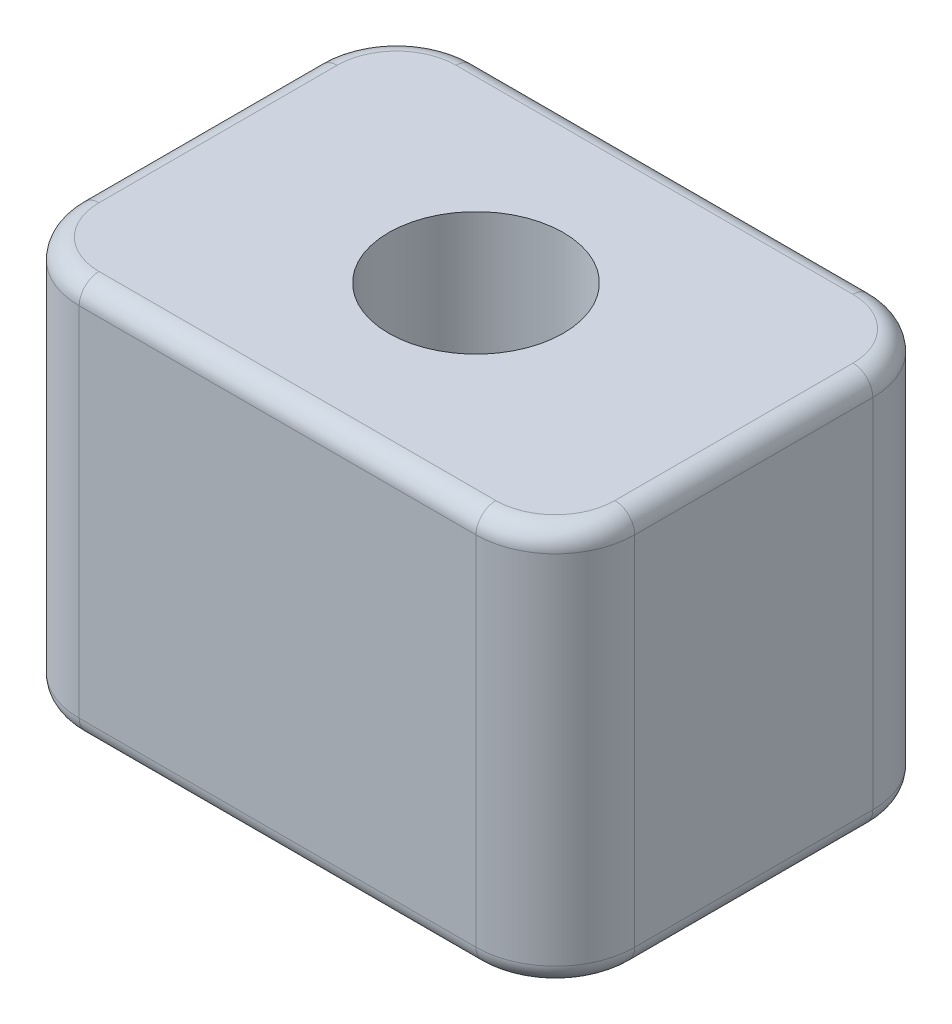
ISO-10303-21;
HEADER;
FILE_DESCRIPTION(('STEP AP214'),'2;1');
FILE_NAME('part.step','',(''),(''),'','','');
FILE_SCHEMA(('AUTOMOTIVE_DESIGN { 1 0 10303 214 1 1 1 1 }'));
ENDSEC;
DATA;
#1=APPLICATION_CONTEXT('core data for automotive mechanical design processes');
#2=APPLICATION_PROTOCOL_DEFINITION('international standard','automotive_design',2000,#1);
#3=PRODUCT_CONTEXT('',#1,'mechanical');
#4=PRODUCT('Part','Part','',(#3));
#5=PRODUCT_RELATED_PRODUCT_CATEGORY('part','',(#4));
#6=PRODUCT_DEFINITION_FORMATION('','',#4);
#7=PRODUCT_DEFINITION_CONTEXT('part definition',#1,'design');
#8=PRODUCT_DEFINITION('design','',#6,#7);
#9=PRODUCT_DEFINITION_SHAPE('','',#8);
#10=(LENGTH_UNIT() NAMED_UNIT(*) SI_UNIT(.MILLI.,.METRE.));
#11=(NAMED_UNIT(*) PLANE_ANGLE_UNIT() SI_UNIT($,.RADIAN.));
#12=(NAMED_UNIT(*) SI_UNIT($,.STERADIAN.) SOLID_ANGLE_UNIT());
#13=UNCERTAINTY_MEASURE_WITH_UNIT(LENGTH_MEASURE(1.E-05),#10,'distance_accuracy_value','');
#14=(GEOMETRIC_REPRESENTATION_CONTEXT(3) GLOBAL_UNCERTAINTY_ASSIGNED_CONTEXT((#13)) GLOBAL_UNIT_ASSIGNED_CONTEXT((#10,
#11,#12)) REPRESENTATION_CONTEXT('',''));
#15=CARTESIAN_POINT('',(0.,0.,0.));
#16=DIRECTION('',(0.,0.,1.));
#17=DIRECTION('',(1.,0.,0.));
#18=AXIS2_PLACEMENT_3D('',#15,#16,#17);
#19=CARTESIAN_POINT('',(0.,5.,0.));
#20=DIRECTION('',(0.,-1.,0.));
#21=DIRECTION('',(0.,0.,-1.));
#22=AXIS2_PLACEMENT_3D('',#19,#20,#21);
#23=PLANE('',#22);
#24=DIRECTION('',(0.,0.,1.));
#25=VECTOR('',#24,1.);
#26=CARTESIAN_POINT('',(-3.25,5.,0.));
#27=LINE('',#26,#25);
#28=CARTESIAN_POINT('',(-3.25,5.,-1.5));
#29=VERTEX_POINT('',#28);
#30=CARTESIAN_POINT('',(-3.25,5.,1.5));
#31=VERTEX_POINT('',#30);
#32=EDGE_CURVE('E171',#29,#31,#27,.T.);
#33=ORIENTED_EDGE('',*,*,#32,.T.);
#34=CARTESIAN_POINT('',(-2.5,5.,1.5));
#35=DIRECTION('',(0.,-1.,0.));
#36=DIRECTION('',(0.,0.,-1.));
#37=AXIS2_PLACEMENT_3D('',#34,#35,#36);
#38=CIRCLE('',#37,0.75);
#39=CARTESIAN_POINT('',(-2.5,5.,2.25));
#40=VERTEX_POINT('',#39);
#41=EDGE_CURVE('E152',#31,#40,#38,.F.);
#42=ORIENTED_EDGE('',*,*,#41,.T.);
#43=DIRECTION('',(1.,0.,0.));
#44=VECTOR('',#43,1.);
#45=CARTESIAN_POINT('',(0.,5.,2.25));
#46=LINE('',#45,#44);
#47=CARTESIAN_POINT('',(2.5,5.,2.25));
#48=VERTEX_POINT('',#47);
#49=EDGE_CURVE('E160',#40,#48,#46,.T.);
#50=ORIENTED_EDGE('',*,*,#49,.T.);
#51=CARTESIAN_POINT('',(2.5,5.,1.5));
#52=DIRECTION('',(0.,-1.,0.));
#53=DIRECTION('',(0.,0.,-1.));
#54=AXIS2_PLACEMENT_3D('',#51,#52,#53);
#55=CIRCLE('',#54,0.75);
#56=CARTESIAN_POINT('',(3.25,5.,1.5));
#57=VERTEX_POINT('',#56);
#58=EDGE_CURVE('E166',#48,#57,#55,.F.);
#59=ORIENTED_EDGE('',*,*,#58,.T.);
#60=DIRECTION('',(0.,0.,-1.));
#61=VECTOR('',#60,1.);
#62=CARTESIAN_POINT('',(3.25,5.,0.));
#63=LINE('',#62,#61);
#64=CARTESIAN_POINT('',(3.25,5.,-1.5));
#65=VERTEX_POINT('',#64);
#66=EDGE_CURVE('E302',#57,#65,#63,.T.);
#67=ORIENTED_EDGE('',*,*,#66,.T.);
#68=CARTESIAN_POINT('',(2.5,5.,-1.5));
#69=DIRECTION('',(0.,-1.,0.));
#70=DIRECTION('',(0.,0.,-1.));
#71=AXIS2_PLACEMENT_3D('',#68,#69,#70);
#72=CIRCLE('',#71,0.75);
#73=CARTESIAN_POINT('',(2.5,5.,-2.25));
#74=VERTEX_POINT('',#73);
#75=EDGE_CURVE('E304',#65,#74,#72,.F.);
#76=ORIENTED_EDGE('',*,*,#75,.T.);
#77=DIRECTION('',(-1.,0.,0.));
#78=VECTOR('',#77,1.);
#79=CARTESIAN_POINT('',(0.,5.,-2.25));
#80=LINE('',#79,#78);
#81=CARTESIAN_POINT('',(-2.5,5.,-2.25));
#82=VERTEX_POINT('',#81);
#83=EDGE_CURVE('E306',#74,#82,#80,.T.);
#84=ORIENTED_EDGE('',*,*,#83,.T.);
#85=CARTESIAN_POINT('',(-2.5,5.,-1.5));
#86=DIRECTION('',(0.,-1.,0.));
#87=DIRECTION('',(0.,0.,-1.));
#88=AXIS2_PLACEMENT_3D('',#85,#86,#87);
#89=CIRCLE('',#88,0.75);
#90=EDGE_CURVE('E176',#82,#29,#89,.F.);
#91=ORIENTED_EDGE('',*,*,#90,.T.);
#92=EDGE_LOOP('',(#33,#42,#50,#59,#67,#76,#84,#91));
#93=FACE_BOUND('',#92,.T.);
#94=CARTESIAN_POINT('',(0.,5.,0.));
#95=DIRECTION('',(0.,1.,0.));
#96=DIRECTION('',(0.,0.,1.));
#97=AXIS2_PLACEMENT_3D('',#94,#95,#96);
#98=CIRCLE('',#97,1.1);
#99=CARTESIAN_POINT('',(0.,5.,1.1));
#100=VERTEX_POINT('',#99);
#101=EDGE_CURVE('E596',#100,#100,#98,.T.);
#102=ORIENTED_EDGE('',*,*,#101,.F.);
#103=EDGE_LOOP('',(#102));
#104=FACE_BOUND('',#103,.T.);
#105=ADVANCED_FACE('F35',(#93,#104),#23,.F.);
#106=CARTESIAN_POINT('',(0.,0.,0.));
#107=DIRECTION('',(0.,-1.,0.));
#108=DIRECTION('',(0.,0.,-1.));
#109=AXIS2_PLACEMENT_3D('',#106,#107,#108);
#110=PLANE('',#109);
#111=CARTESIAN_POINT('',(2.5,0.,-1.5));
#112=DIRECTION('',(0.,-1.,0.));
#113=DIRECTION('',(0.,0.,-1.));
#114=AXIS2_PLACEMENT_3D('',#111,#112,#113);
#115=CIRCLE('',#114,0.75);
#116=CARTESIAN_POINT('',(2.5,0.,-2.25));
#117=VERTEX_POINT('',#116);
#118=CARTESIAN_POINT('',(3.25,0.,-1.5));
#119=VERTEX_POINT('',#118);
#120=EDGE_CURVE('E52',#117,#119,#115,.T.);
#121=ORIENTED_EDGE('',*,*,#120,.T.);
#122=DIRECTION('',(0.,0.,-1.));
#123=VECTOR('',#122,1.);
#124=CARTESIAN_POINT('',(3.25,0.,1.5));
#125=LINE('',#124,#123);
#126=CARTESIAN_POINT('',(3.25,0.,1.5));
#127=VERTEX_POINT('',#126);
#128=EDGE_CURVE('E56',#119,#127,#125,.F.);
#129=ORIENTED_EDGE('',*,*,#128,.T.);
#130=CARTESIAN_POINT('',(2.5,0.,1.5));
#131=DIRECTION('',(0.,-1.,0.));
#132=DIRECTION('',(0.,0.,-1.));
#133=AXIS2_PLACEMENT_3D('',#130,#131,#132);
#134=CIRCLE('',#133,0.75);
#135=CARTESIAN_POINT('',(2.5,0.,2.25));
#136=VERTEX_POINT('',#135);
#137=EDGE_CURVE('E217',#127,#136,#134,.T.);
#138=ORIENTED_EDGE('',*,*,#137,.T.);
#139=DIRECTION('',(1.,0.,0.));
#140=VECTOR('',#139,1.);
#141=CARTESIAN_POINT('',(-2.5,0.,2.25));
#142=LINE('',#141,#140);
#143=CARTESIAN_POINT('',(-2.5,0.,2.25));
#144=VERTEX_POINT('',#143);
#145=EDGE_CURVE('E215',#136,#144,#142,.F.);
#146=ORIENTED_EDGE('',*,*,#145,.T.);
#147=CARTESIAN_POINT('',(-2.5,0.,1.5));
#148=DIRECTION('',(0.,-1.,0.));
#149=DIRECTION('',(0.,0.,-1.));
#150=AXIS2_PLACEMENT_3D('',#147,#148,#149);
#151=CIRCLE('',#150,0.75);
#152=CARTESIAN_POINT('',(-3.25,0.,1.5));
#153=VERTEX_POINT('',#152);
#154=EDGE_CURVE('E208',#144,#153,#151,.T.);
#155=ORIENTED_EDGE('',*,*,#154,.T.);
#156=DIRECTION('',(0.,0.,1.));
#157=VECTOR('',#156,1.);
#158=CARTESIAN_POINT('',(-3.25,0.,-1.5));
#159=LINE('',#158,#157);
#160=CARTESIAN_POINT('',(-3.25,0.,-1.5));
#161=VERTEX_POINT('',#160);
#162=EDGE_CURVE('E206',#153,#161,#159,.F.);
#163=ORIENTED_EDGE('',*,*,#162,.T.);
#164=CARTESIAN_POINT('',(-2.5,0.,-1.5));
#165=DIRECTION('',(0.,-1.,0.));
#166=DIRECTION('',(0.,0.,-1.));
#167=AXIS2_PLACEMENT_3D('',#164,#165,#166);
#168=CIRCLE('',#167,0.75);
#169=CARTESIAN_POINT('',(-2.5,0.,-2.25));
#170=VERTEX_POINT('',#169);
#171=EDGE_CURVE('E210',#161,#170,#168,.T.);
#172=ORIENTED_EDGE('',*,*,#171,.T.);
#173=DIRECTION('',(-1.,0.,0.));
#174=VECTOR('',#173,1.);
#175=CARTESIAN_POINT('',(2.5,0.,-2.25));
#176=LINE('',#175,#174);
#177=EDGE_CURVE('E213',#170,#117,#176,.F.);
#178=ORIENTED_EDGE('',*,*,#177,.T.);
#179=EDGE_LOOP('',(#121,#129,#138,#146,#155,#163,#172,#178));
#180=FACE_BOUND('',#179,.T.);
#181=CARTESIAN_POINT('',(0.,0.,0.));
#182=DIRECTION('',(0.,1.,0.));
#183=DIRECTION('',(0.,0.,1.));
#184=AXIS2_PLACEMENT_3D('',#181,#182,#183);
#185=CIRCLE('',#184,1.1);
#186=CARTESIAN_POINT('',(0.,0.,1.1));
#187=VERTEX_POINT('',#186);
#188=EDGE_CURVE('E239',#187,#187,#185,.T.);
#189=ORIENTED_EDGE('',*,*,#188,.T.);
#190=EDGE_LOOP('',(#189));
#191=FACE_BOUND('',#190,.T.);
#192=ADVANCED_FACE('F345',(#180,#191),#110,.T.);
#193=CARTESIAN_POINT('',(3.5,5.,2.5));
#194=DIRECTION('',(-1.,0.,0.));
#195=DIRECTION('',(0.,0.,1.));
#196=AXIS2_PLACEMENT_3D('',#193,#194,#195);
#197=PLANE('',#196);
#198=DIRECTION('',(0.,-1.,0.));
#199=VECTOR('',#198,1.);
#200=CARTESIAN_POINT('',(3.5,5.,-1.5));
#201=LINE('',#200,#199);
#202=CARTESIAN_POINT('',(3.5,0.25,-1.5));
#203=VERTEX_POINT('',#202);
#204=CARTESIAN_POINT('',(3.5,4.75,-1.5));
#205=VERTEX_POINT('',#204);
#206=EDGE_CURVE('E283',#203,#205,#201,.F.);
#207=ORIENTED_EDGE('',*,*,#206,.T.);
#208=DIRECTION('',(0.,0.,-1.));
#209=VECTOR('',#208,1.);
#210=CARTESIAN_POINT('',(3.5,4.75,2.5));
#211=LINE('',#210,#209);
#212=CARTESIAN_POINT('',(3.5,4.75,1.5));
#213=VERTEX_POINT('',#212);
#214=EDGE_CURVE('E200',#205,#213,#211,.F.);
#215=ORIENTED_EDGE('',*,*,#214,.T.);
#216=DIRECTION('',(0.,-1.,0.));
#217=VECTOR('',#216,1.);
#218=CARTESIAN_POINT('',(3.5,5.,1.5));
#219=LINE('',#218,#217);
#220=CARTESIAN_POINT('',(3.5,0.25,1.5));
#221=VERTEX_POINT('',#220);
#222=EDGE_CURVE('E274',#213,#221,#219,.T.);
#223=ORIENTED_EDGE('',*,*,#222,.T.);
#224=DIRECTION('',(0.,0.,-1.));
#225=VECTOR('',#224,1.);
#226=CARTESIAN_POINT('',(3.5,0.25,-1.5));
#227=LINE('',#226,#225);
#228=EDGE_CURVE('E198',#221,#203,#227,.T.);
#229=ORIENTED_EDGE('',*,*,#228,.T.);
#230=EDGE_LOOP('',(#207,#215,#223,#229));
#231=FACE_BOUND('',#230,.T.);
#232=ADVANCED_FACE('F280',(#231),#197,.F.);
#233=CARTESIAN_POINT('',(-3.5,5.,-2.5));
#234=DIRECTION('',(0.,0.,1.));
#235=DIRECTION('',(1.,0.,0.));
#236=AXIS2_PLACEMENT_3D('',#233,#234,#235);
#237=PLANE('',#236);
#238=DIRECTION('',(0.,-1.,0.));
#239=VECTOR('',#238,1.);
#240=CARTESIAN_POINT('',(-2.5,5.,-2.5));
#241=LINE('',#240,#239);
#242=CARTESIAN_POINT('',(-2.5,0.25,-2.5));
#243=VERTEX_POINT('',#242);
#244=CARTESIAN_POINT('',(-2.5,4.75,-2.5));
#245=VERTEX_POINT('',#244);
#246=EDGE_CURVE('E289',#243,#245,#241,.F.);
#247=ORIENTED_EDGE('',*,*,#246,.T.);
#248=DIRECTION('',(-1.,0.,0.));
#249=VECTOR('',#248,1.);
#250=CARTESIAN_POINT('',(-3.5,4.75,-2.5));
#251=LINE('',#250,#249);
#252=CARTESIAN_POINT('',(2.5,4.75,-2.5));
#253=VERTEX_POINT('',#252);
#254=EDGE_CURVE('E192',#245,#253,#251,.F.);
#255=ORIENTED_EDGE('',*,*,#254,.T.);
#256=DIRECTION('',(0.,-1.,0.));
#257=VECTOR('',#256,1.);
#258=CARTESIAN_POINT('',(2.5,5.,-2.5));
#259=LINE('',#258,#257);
#260=CARTESIAN_POINT('',(2.5,0.25,-2.5));
#261=VERTEX_POINT('',#260);
#262=EDGE_CURVE('E284',#253,#261,#259,.T.);
#263=ORIENTED_EDGE('',*,*,#262,.T.);
#264=DIRECTION('',(-1.,0.,0.));
#265=VECTOR('',#264,1.);
#266=CARTESIAN_POINT('',(-2.5,0.25,-2.5));
#267=LINE('',#266,#265);
#268=EDGE_CURVE('E190',#261,#243,#267,.T.);
#269=ORIENTED_EDGE('',*,*,#268,.T.);
#270=EDGE_LOOP('',(#247,#255,#263,#269));
#271=FACE_BOUND('',#270,.T.);
#272=ADVANCED_FACE('F369',(#271),#237,.F.);
#273=CARTESIAN_POINT('',(-3.5,5.,2.5));
#274=DIRECTION('',(1.,0.,0.));
#275=DIRECTION('',(0.,0.,-1.));
#276=AXIS2_PLACEMENT_3D('',#273,#274,#275);
#277=PLANE('',#276);
#278=DIRECTION('',(0.,-1.,0.));
#279=VECTOR('',#278,1.);
#280=CARTESIAN_POINT('',(-3.5,5.,1.5));
#281=LINE('',#280,#279);
#282=CARTESIAN_POINT('',(-3.5,0.25,1.5));
#283=VERTEX_POINT('',#282);
#284=CARTESIAN_POINT('',(-3.5,4.75,1.5));
#285=VERTEX_POINT('',#284);
#286=EDGE_CURVE('E167',#283,#285,#281,.F.);
#287=ORIENTED_EDGE('',*,*,#286,.T.);
#288=DIRECTION('',(0.,0.,1.));
#289=VECTOR('',#288,1.);
#290=CARTESIAN_POINT('',(-3.5,4.75,2.5));
#291=LINE('',#290,#289);
#292=CARTESIAN_POINT('',(-3.5,4.75,-1.5));
#293=VERTEX_POINT('',#292);
#294=EDGE_CURVE('E183',#285,#293,#291,.F.);
#295=ORIENTED_EDGE('',*,*,#294,.T.);
#296=DIRECTION('',(0.,-1.,0.));
#297=VECTOR('',#296,1.);
#298=CARTESIAN_POINT('',(-3.5,5.,-1.5));
#299=LINE('',#298,#297);
#300=CARTESIAN_POINT('',(-3.5,0.25,-1.5));
#301=VERTEX_POINT('',#300);
#302=EDGE_CURVE('E296',#293,#301,#299,.T.);
#303=ORIENTED_EDGE('',*,*,#302,.T.);
#304=DIRECTION('',(0.,0.,1.));
#305=VECTOR('',#304,1.);
#306=CARTESIAN_POINT('',(-3.5,0.25,1.5));
#307=LINE('',#306,#305);
#308=EDGE_CURVE('E181',#301,#283,#307,.T.);
#309=ORIENTED_EDGE('',*,*,#308,.T.);
#310=EDGE_LOOP('',(#287,#295,#303,#309));
#311=FACE_BOUND('',#310,.T.);
#312=ADVANCED_FACE('F324',(#311),#277,.F.);
#313=CARTESIAN_POINT('',(-3.5,5.,2.5));
#314=DIRECTION('',(0.,0.,-1.));
#315=DIRECTION('',(-1.,0.,0.));
#316=AXIS2_PLACEMENT_3D('',#313,#314,#315);
#317=PLANE('',#316);
#318=DIRECTION('',(0.,-1.,0.));
#319=VECTOR('',#318,1.);
#320=CARTESIAN_POINT('',(2.5,5.,2.5));
#321=LINE('',#320,#319);
#322=CARTESIAN_POINT('',(2.5,0.25,2.5));
#323=VERTEX_POINT('',#322);
#324=CARTESIAN_POINT('',(2.5,4.75,2.5));
#325=VERTEX_POINT('',#324);
#326=EDGE_CURVE('E277',#323,#325,#321,.F.);
#327=ORIENTED_EDGE('',*,*,#326,.T.);
#328=DIRECTION('',(1.,0.,0.));
#329=VECTOR('',#328,1.);
#330=CARTESIAN_POINT('',(-3.5,4.75,2.5));
#331=LINE('',#330,#329);
#332=CARTESIAN_POINT('',(-2.5,4.75,2.5));
#333=VERTEX_POINT('',#332);
#334=EDGE_CURVE('E11',#325,#333,#331,.F.);
#335=ORIENTED_EDGE('',*,*,#334,.T.);
#336=DIRECTION('',(0.,-1.,0.));
#337=VECTOR('',#336,1.);
#338=CARTESIAN_POINT('',(-2.5,5.,2.5));
#339=LINE('',#338,#337);
#340=CARTESIAN_POINT('',(-2.5,0.25,2.5));
#341=VERTEX_POINT('',#340);
#342=EDGE_CURVE('E286',#333,#341,#339,.T.);
#343=ORIENTED_EDGE('',*,*,#342,.T.);
#344=DIRECTION('',(1.,0.,0.));
#345=VECTOR('',#344,1.);
#346=CARTESIAN_POINT('',(2.5,0.25,2.5));
#347=LINE('',#346,#345);
#348=EDGE_CURVE('E44',#341,#323,#347,.T.);
#349=ORIENTED_EDGE('',*,*,#348,.T.);
#350=EDGE_LOOP('',(#327,#335,#343,#349));
#351=FACE_BOUND('',#350,.T.);
#352=ADVANCED_FACE('F351',(#351),#317,.F.);
#353=CARTESIAN_POINT('',(0.,5.,0.));
#354=DIRECTION('',(0.,-1.,0.));
#355=DIRECTION('',(0.,0.,-1.));
#356=AXIS2_PLACEMENT_3D('',#353,#354,#355);
#357=CYLINDRICAL_SURFACE('',#356,1.1);
#358=ORIENTED_EDGE('',*,*,#101,.T.);
#359=EDGE_LOOP('',(#358));
#360=FACE_BOUND('',#359,.T.);
#361=ORIENTED_EDGE('',*,*,#188,.F.);
#362=EDGE_LOOP('',(#361));
#363=FACE_BOUND('',#362,.T.);
#364=ADVANCED_FACE('F391',(#360,#363),#357,.F.);
#365=CARTESIAN_POINT('',(2.5,5.,-1.5));
#366=DIRECTION('',(0.,-1.,0.));
#367=DIRECTION('',(0.,0.,-1.));
#368=AXIS2_PLACEMENT_3D('',#365,#366,#367);
#369=CYLINDRICAL_SURFACE('',#368,1.);
#370=ORIENTED_EDGE('',*,*,#262,.F.);
#371=CARTESIAN_POINT('',(2.5,4.75,-1.5));
#372=DIRECTION('',(0.,-1.,0.));
#373=DIRECTION('',(0.,0.,-1.));
#374=AXIS2_PLACEMENT_3D('',#371,#372,#373);
#375=CIRCLE('',#374,1.);
#376=EDGE_CURVE('E196',#253,#205,#375,.T.);
#377=ORIENTED_EDGE('',*,*,#376,.T.);
#378=ORIENTED_EDGE('',*,*,#206,.F.);
#379=CARTESIAN_POINT('',(2.5,0.25,-1.5));
#380=DIRECTION('',(0.,-1.,0.));
#381=DIRECTION('',(0.,0.,-1.));
#382=AXIS2_PLACEMENT_3D('',#379,#380,#381);
#383=CIRCLE('',#382,1.);
#384=EDGE_CURVE('E194',#203,#261,#383,.F.);
#385=ORIENTED_EDGE('',*,*,#384,.T.);
#386=EDGE_LOOP('',(#370,#377,#378,#385));
#387=FACE_BOUND('',#386,.T.);
#388=ADVANCED_FACE('F371',(#387),#369,.T.);
#389=CARTESIAN_POINT('',(2.5,5.,1.5));
#390=DIRECTION('',(0.,-1.,0.));
#391=DIRECTION('',(0.,0.,-1.));
#392=AXIS2_PLACEMENT_3D('',#389,#390,#391);
#393=CYLINDRICAL_SURFACE('',#392,1.);
#394=ORIENTED_EDGE('',*,*,#222,.F.);
#395=CARTESIAN_POINT('',(2.5,4.75,1.5));
#396=DIRECTION('',(0.,-1.,0.));
#397=DIRECTION('',(0.,0.,-1.));
#398=AXIS2_PLACEMENT_3D('',#395,#396,#397);
#399=CIRCLE('',#398,1.);
#400=EDGE_CURVE('E204',#213,#325,#399,.T.);
#401=ORIENTED_EDGE('',*,*,#400,.T.);
#402=ORIENTED_EDGE('',*,*,#326,.F.);
#403=CARTESIAN_POINT('',(2.5,0.25,1.5));
#404=DIRECTION('',(0.,-1.,0.));
#405=DIRECTION('',(0.,0.,-1.));
#406=AXIS2_PLACEMENT_3D('',#403,#404,#405);
#407=CIRCLE('',#406,1.);
#408=EDGE_CURVE('E202',#323,#221,#407,.F.);
#409=ORIENTED_EDGE('',*,*,#408,.T.);
#410=EDGE_LOOP('',(#394,#401,#402,#409));
#411=FACE_BOUND('',#410,.T.);
#412=ADVANCED_FACE('F273',(#411),#393,.T.);
#413=CARTESIAN_POINT('',(-2.5,5.,1.5));
#414=DIRECTION('',(0.,-1.,0.));
#415=DIRECTION('',(0.,0.,-1.));
#416=AXIS2_PLACEMENT_3D('',#413,#414,#415);
#417=CYLINDRICAL_SURFACE('',#416,1.);
#418=ORIENTED_EDGE('',*,*,#342,.F.);
#419=CARTESIAN_POINT('',(-2.5,4.75,1.5));
#420=DIRECTION('',(0.,-1.,0.));
#421=DIRECTION('',(0.,0.,-1.));
#422=AXIS2_PLACEMENT_3D('',#419,#420,#421);
#423=CIRCLE('',#422,1.);
#424=EDGE_CURVE('E154',#333,#285,#423,.T.);
#425=ORIENTED_EDGE('',*,*,#424,.T.);
#426=ORIENTED_EDGE('',*,*,#286,.F.);
#427=CARTESIAN_POINT('',(-2.5,0.25,1.5));
#428=DIRECTION('',(0.,-1.,0.));
#429=DIRECTION('',(0.,0.,-1.));
#430=AXIS2_PLACEMENT_3D('',#427,#428,#429);
#431=CIRCLE('',#430,1.);
#432=EDGE_CURVE('E173',#283,#341,#431,.F.);
#433=ORIENTED_EDGE('',*,*,#432,.T.);
#434=EDGE_LOOP('',(#418,#425,#426,#433));
#435=FACE_BOUND('',#434,.T.);
#436=ADVANCED_FACE('F322',(#435),#417,.T.);
#437=CARTESIAN_POINT('',(-2.5,5.,-1.5));
#438=DIRECTION('',(0.,-1.,0.));
#439=DIRECTION('',(0.,0.,-1.));
#440=AXIS2_PLACEMENT_3D('',#437,#438,#439);
#441=CYLINDRICAL_SURFACE('',#440,1.);
#442=ORIENTED_EDGE('',*,*,#302,.F.);
#443=CARTESIAN_POINT('',(-2.5,4.75,-1.5));
#444=DIRECTION('',(0.,-1.,0.));
#445=DIRECTION('',(0.,0.,-1.));
#446=AXIS2_PLACEMENT_3D('',#443,#444,#445);
#447=CIRCLE('',#446,1.);
#448=EDGE_CURVE('E188',#293,#245,#447,.T.);
#449=ORIENTED_EDGE('',*,*,#448,.T.);
#450=ORIENTED_EDGE('',*,*,#246,.F.);
#451=CARTESIAN_POINT('',(-2.5,0.25,-1.5));
#452=DIRECTION('',(0.,-1.,0.));
#453=DIRECTION('',(0.,0.,-1.));
#454=AXIS2_PLACEMENT_3D('',#451,#452,#453);
#455=CIRCLE('',#454,1.);
#456=EDGE_CURVE('E185',#243,#301,#455,.F.);
#457=ORIENTED_EDGE('',*,*,#456,.T.);
#458=EDGE_LOOP('',(#442,#449,#450,#457));
#459=FACE_BOUND('',#458,.T.);
#460=ADVANCED_FACE('F335',(#459),#441,.T.);
#461=CARTESIAN_POINT('',(2.5,4.75,-1.5));
#462=DIRECTION('',(0.,-1.,0.));
#463=DIRECTION('',(0.,0.,-1.));
#464=AXIS2_PLACEMENT_3D('',#461,#462,#463);
#465=TOROIDAL_SURFACE('',#464,0.75,0.25);
#466=CARTESIAN_POINT('',(3.25,4.75,-1.5));
#467=DIRECTION('',(0.,0.,1.));
#468=DIRECTION('',(1.,0.,0.));
#469=AXIS2_PLACEMENT_3D('',#466,#467,#468);
#470=CIRCLE('',#469,0.25);
#471=EDGE_CURVE('E233',#205,#65,#470,.T.);
#472=ORIENTED_EDGE('',*,*,#471,.F.);
#473=ORIENTED_EDGE('',*,*,#376,.F.);
#474=CARTESIAN_POINT('',(2.5,4.75,-2.25));
#475=DIRECTION('',(-1.,0.,0.));
#476=DIRECTION('',(0.,0.,1.));
#477=AXIS2_PLACEMENT_3D('',#474,#475,#476);
#478=CIRCLE('',#477,0.25);
#479=EDGE_CURVE('E236',#74,#253,#478,.T.);
#480=ORIENTED_EDGE('',*,*,#479,.F.);
#481=ORIENTED_EDGE('',*,*,#75,.F.);
#482=EDGE_LOOP('',(#472,#473,#480,#481));
#483=FACE_BOUND('',#482,.T.);
#484=ADVANCED_FACE('F362',(#483),#465,.T.);
#485=CARTESIAN_POINT('',(0.,4.75,-2.25));
#486=DIRECTION('',(-1.,0.,0.));
#487=DIRECTION('',(0.,0.,1.));
#488=AXIS2_PLACEMENT_3D('',#485,#486,#487);
#489=CYLINDRICAL_SURFACE('',#488,0.25);
#490=ORIENTED_EDGE('',*,*,#479,.T.);
#491=ORIENTED_EDGE('',*,*,#254,.F.);
#492=CARTESIAN_POINT('',(-2.5,4.75,-2.25));
#493=DIRECTION('',(-1.,0.,0.));
#494=DIRECTION('',(0.,0.,1.));
#495=AXIS2_PLACEMENT_3D('',#492,#493,#494);
#496=CIRCLE('',#495,0.25);
#497=EDGE_CURVE('E230',#82,#245,#496,.T.);
#498=ORIENTED_EDGE('',*,*,#497,.F.);
#499=ORIENTED_EDGE('',*,*,#83,.F.);
#500=EDGE_LOOP('',(#490,#491,#498,#499));
#501=FACE_BOUND('',#500,.T.);
#502=ADVANCED_FACE('F366',(#501),#489,.T.);
#503=CARTESIAN_POINT('',(3.25,4.75,0.));
#504=DIRECTION('',(0.,0.,-1.));
#505=DIRECTION('',(-1.,0.,0.));
#506=AXIS2_PLACEMENT_3D('',#503,#504,#505);
#507=CYLINDRICAL_SURFACE('',#506,0.25);
#508=ORIENTED_EDGE('',*,*,#471,.T.);
#509=ORIENTED_EDGE('',*,*,#66,.F.);
#510=CARTESIAN_POINT('',(3.25,4.75,1.5));
#511=DIRECTION('',(0.,0.,1.));
#512=DIRECTION('',(1.,0.,0.));
#513=AXIS2_PLACEMENT_3D('',#510,#511,#512);
#514=CIRCLE('',#513,0.25);
#515=EDGE_CURVE('E227',#213,#57,#514,.T.);
#516=ORIENTED_EDGE('',*,*,#515,.F.);
#517=ORIENTED_EDGE('',*,*,#214,.F.);
#518=EDGE_LOOP('',(#508,#509,#516,#517));
#519=FACE_BOUND('',#518,.T.);
#520=ADVANCED_FACE('F358',(#519),#507,.T.);
#521=CARTESIAN_POINT('',(-2.5,4.75,-1.5));
#522=DIRECTION('',(0.,-1.,0.));
#523=DIRECTION('',(0.,0.,-1.));
#524=AXIS2_PLACEMENT_3D('',#521,#522,#523);
#525=TOROIDAL_SURFACE('',#524,0.75,0.25);
#526=ORIENTED_EDGE('',*,*,#497,.T.);
#527=ORIENTED_EDGE('',*,*,#448,.F.);
#528=CARTESIAN_POINT('',(-3.25,4.75,-1.5));
#529=DIRECTION('',(0.,0.,1.));
#530=DIRECTION('',(1.,0.,0.));
#531=AXIS2_PLACEMENT_3D('',#528,#529,#530);
#532=CIRCLE('',#531,0.25);
#533=EDGE_CURVE('E224',#29,#293,#532,.T.);
#534=ORIENTED_EDGE('',*,*,#533,.F.);
#535=ORIENTED_EDGE('',*,*,#90,.F.);
#536=EDGE_LOOP('',(#526,#527,#534,#535));
#537=FACE_BOUND('',#536,.T.);
#538=ADVANCED_FACE('F313',(#537),#525,.T.);
#539=CARTESIAN_POINT('',(2.5,4.75,1.5));
#540=DIRECTION('',(0.,-1.,0.));
#541=DIRECTION('',(0.,0.,-1.));
#542=AXIS2_PLACEMENT_3D('',#539,#540,#541);
#543=TOROIDAL_SURFACE('',#542,0.75,0.25);
#544=ORIENTED_EDGE('',*,*,#515,.T.);
#545=ORIENTED_EDGE('',*,*,#58,.F.);
#546=CARTESIAN_POINT('',(2.5,4.75,2.25));
#547=DIRECTION('',(-1.,0.,0.));
#548=DIRECTION('',(0.,0.,1.));
#549=AXIS2_PLACEMENT_3D('',#546,#547,#548);
#550=CIRCLE('',#549,0.25);
#551=EDGE_CURVE('E163',#325,#48,#550,.T.);
#552=ORIENTED_EDGE('',*,*,#551,.F.);
#553=ORIENTED_EDGE('',*,*,#400,.F.);
#554=EDGE_LOOP('',(#544,#545,#552,#553));
#555=FACE_BOUND('',#554,.T.);
#556=ADVANCED_FACE('F354',(#555),#543,.T.);
#557=CARTESIAN_POINT('',(-3.25,4.75,0.));
#558=DIRECTION('',(0.,0.,1.));
#559=DIRECTION('',(1.,0.,0.));
#560=AXIS2_PLACEMENT_3D('',#557,#558,#559);
#561=CYLINDRICAL_SURFACE('',#560,0.25);
#562=ORIENTED_EDGE('',*,*,#533,.T.);
#563=ORIENTED_EDGE('',*,*,#294,.F.);
#564=CARTESIAN_POINT('',(-3.25,4.75,1.5));
#565=DIRECTION('',(0.,0.,1.));
#566=DIRECTION('',(1.,0.,0.));
#567=AXIS2_PLACEMENT_3D('',#564,#565,#566);
#568=CIRCLE('',#567,0.25);
#569=EDGE_CURVE('E157',#31,#285,#568,.T.);
#570=ORIENTED_EDGE('',*,*,#569,.F.);
#571=ORIENTED_EDGE('',*,*,#32,.F.);
#572=EDGE_LOOP('',(#562,#563,#570,#571));
#573=FACE_BOUND('',#572,.T.);
#574=ADVANCED_FACE('F316',(#573),#561,.T.);
#575=CARTESIAN_POINT('',(0.,4.75,2.25));
#576=DIRECTION('',(1.,0.,0.));
#577=DIRECTION('',(0.,0.,-1.));
#578=AXIS2_PLACEMENT_3D('',#575,#576,#577);
#579=CYLINDRICAL_SURFACE('',#578,0.25);
#580=ORIENTED_EDGE('',*,*,#551,.T.);
#581=ORIENTED_EDGE('',*,*,#49,.F.);
#582=CARTESIAN_POINT('',(-2.5,4.75,2.25));
#583=DIRECTION('',(-1.,0.,0.));
#584=DIRECTION('',(0.,0.,1.));
#585=AXIS2_PLACEMENT_3D('',#582,#583,#584);
#586=CIRCLE('',#585,0.25);
#587=EDGE_CURVE('E148',#333,#40,#586,.T.);
#588=ORIENTED_EDGE('',*,*,#587,.F.);
#589=ORIENTED_EDGE('',*,*,#334,.F.);
#590=EDGE_LOOP('',(#580,#581,#588,#589));
#591=FACE_BOUND('',#590,.T.);
#592=ADVANCED_FACE('F161',(#591),#579,.T.);
#593=CARTESIAN_POINT('',(-2.5,4.75,1.5));
#594=DIRECTION('',(0.,-1.,0.));
#595=DIRECTION('',(0.,0.,-1.));
#596=AXIS2_PLACEMENT_3D('',#593,#594,#595);
#597=TOROIDAL_SURFACE('',#596,0.75,0.25);
#598=ORIENTED_EDGE('',*,*,#569,.T.);
#599=ORIENTED_EDGE('',*,*,#424,.F.);
#600=ORIENTED_EDGE('',*,*,#587,.T.);
#601=ORIENTED_EDGE('',*,*,#41,.F.);
#602=EDGE_LOOP('',(#598,#599,#600,#601));
#603=FACE_BOUND('',#602,.T.);
#604=ADVANCED_FACE('F150',(#603),#597,.T.);
#605=CARTESIAN_POINT('',(2.5,0.25,1.5));
#606=DIRECTION('',(0.,-1.,0.));
#607=DIRECTION('',(0.,0.,-1.));
#608=AXIS2_PLACEMENT_3D('',#605,#606,#607);
#609=TOROIDAL_SURFACE('',#608,0.75,0.25);
#610=CARTESIAN_POINT('',(3.25,0.25,1.5));
#611=DIRECTION('',(0.,0.,-1.));
#612=DIRECTION('',(-1.,0.,0.));
#613=AXIS2_PLACEMENT_3D('',#610,#611,#612);
#614=CIRCLE('',#613,0.25);
#615=EDGE_CURVE('E255',#221,#127,#614,.T.);
#616=ORIENTED_EDGE('',*,*,#615,.F.);
#617=ORIENTED_EDGE('',*,*,#408,.F.);
#618=CARTESIAN_POINT('',(2.5,0.25,2.25));
#619=DIRECTION('',(-1.,0.,0.));
#620=DIRECTION('',(0.,0.,1.));
#621=AXIS2_PLACEMENT_3D('',#618,#619,#620);
#622=CIRCLE('',#621,0.25);
#623=EDGE_CURVE('E39',#136,#323,#622,.T.);
#624=ORIENTED_EDGE('',*,*,#623,.F.);
#625=ORIENTED_EDGE('',*,*,#137,.F.);
#626=EDGE_LOOP('',(#616,#617,#624,#625));
#627=FACE_BOUND('',#626,.T.);
#628=ADVANCED_FACE('F37',(#627),#609,.T.);
#629=CARTESIAN_POINT('',(-3.5,0.25,2.25));
#630=DIRECTION('',(-1.,0.,0.));
#631=DIRECTION('',(0.,0.,1.));
#632=AXIS2_PLACEMENT_3D('',#629,#630,#631);
#633=CYLINDRICAL_SURFACE('',#632,0.25);
#634=ORIENTED_EDGE('',*,*,#623,.T.);
#635=ORIENTED_EDGE('',*,*,#348,.F.);
#636=CARTESIAN_POINT('',(-2.5,0.25,2.25));
#637=DIRECTION('',(-1.,0.,0.));
#638=DIRECTION('',(0.,0.,1.));
#639=AXIS2_PLACEMENT_3D('',#636,#637,#638);
#640=CIRCLE('',#639,0.25);
#641=EDGE_CURVE('E253',#144,#341,#640,.T.);
#642=ORIENTED_EDGE('',*,*,#641,.F.);
#643=ORIENTED_EDGE('',*,*,#145,.F.);
#644=EDGE_LOOP('',(#634,#635,#642,#643));
#645=FACE_BOUND('',#644,.T.);
#646=ADVANCED_FACE('F265',(#645),#633,.T.);
#647=CARTESIAN_POINT('',(3.25,0.25,2.5));
#648=DIRECTION('',(0.,0.,1.));
#649=DIRECTION('',(1.,0.,0.));
#650=AXIS2_PLACEMENT_3D('',#647,#648,#649);
#651=CYLINDRICAL_SURFACE('',#650,0.25);
#652=ORIENTED_EDGE('',*,*,#615,.T.);
#653=ORIENTED_EDGE('',*,*,#128,.F.);
#654=CARTESIAN_POINT('',(3.25,0.25,-1.5));
#655=DIRECTION('',(0.,0.,-1.));
#656=DIRECTION('',(-1.,0.,0.));
#657=AXIS2_PLACEMENT_3D('',#654,#655,#656);
#658=CIRCLE('',#657,0.25);
#659=EDGE_CURVE('E250',#203,#119,#658,.T.);
#660=ORIENTED_EDGE('',*,*,#659,.F.);
#661=ORIENTED_EDGE('',*,*,#228,.F.);
#662=EDGE_LOOP('',(#652,#653,#660,#661));
#663=FACE_BOUND('',#662,.T.);
#664=ADVANCED_FACE('F376',(#663),#651,.T.);
#665=CARTESIAN_POINT('',(-2.5,0.25,1.5));
#666=DIRECTION('',(0.,-1.,0.));
#667=DIRECTION('',(0.,0.,-1.));
#668=AXIS2_PLACEMENT_3D('',#665,#666,#667);
#669=TOROIDAL_SURFACE('',#668,0.75,0.25);
#670=ORIENTED_EDGE('',*,*,#641,.T.);
#671=ORIENTED_EDGE('',*,*,#432,.F.);
#672=CARTESIAN_POINT('',(-3.25,0.25,1.5));
#673=DIRECTION('',(0.,0.,-1.));
#674=DIRECTION('',(-1.,0.,0.));
#675=AXIS2_PLACEMENT_3D('',#672,#673,#674);
#676=CIRCLE('',#675,0.25);
#677=EDGE_CURVE('E247',#153,#283,#676,.T.);
#678=ORIENTED_EDGE('',*,*,#677,.F.);
#679=ORIENTED_EDGE('',*,*,#154,.F.);
#680=EDGE_LOOP('',(#670,#671,#678,#679));
#681=FACE_BOUND('',#680,.T.);
#682=ADVANCED_FACE('F349',(#681),#669,.T.);
#683=CARTESIAN_POINT('',(2.5,0.25,-1.5));
#684=DIRECTION('',(0.,-1.,0.));
#685=DIRECTION('',(0.,0.,-1.));
#686=AXIS2_PLACEMENT_3D('',#683,#684,#685);
#687=TOROIDAL_SURFACE('',#686,0.75,0.25);
#688=ORIENTED_EDGE('',*,*,#659,.T.);
#689=ORIENTED_EDGE('',*,*,#120,.F.);
#690=CARTESIAN_POINT('',(2.5,0.25,-2.25));
#691=DIRECTION('',(-1.,0.,0.));
#692=DIRECTION('',(0.,0.,1.));
#693=AXIS2_PLACEMENT_3D('',#690,#691,#692);
#694=CIRCLE('',#693,0.25);
#695=EDGE_CURVE('E244',#261,#117,#694,.T.);
#696=ORIENTED_EDGE('',*,*,#695,.F.);
#697=ORIENTED_EDGE('',*,*,#384,.F.);
#698=EDGE_LOOP('',(#688,#689,#696,#697));
#699=FACE_BOUND('',#698,.T.);
#700=ADVANCED_FACE('F375',(#699),#687,.T.);
#701=CARTESIAN_POINT('',(-3.25,0.25,2.5));
#702=DIRECTION('',(0.,0.,-1.));
#703=DIRECTION('',(-1.,0.,0.));
#704=AXIS2_PLACEMENT_3D('',#701,#702,#703);
#705=CYLINDRICAL_SURFACE('',#704,0.25);
#706=ORIENTED_EDGE('',*,*,#677,.T.);
#707=ORIENTED_EDGE('',*,*,#308,.F.);
#708=CARTESIAN_POINT('',(-3.25,0.25,-1.5));
#709=DIRECTION('',(0.,0.,-1.));
#710=DIRECTION('',(-1.,0.,0.));
#711=AXIS2_PLACEMENT_3D('',#708,#709,#710);
#712=CIRCLE('',#711,0.25);
#713=EDGE_CURVE('E242',#161,#301,#712,.T.);
#714=ORIENTED_EDGE('',*,*,#713,.F.);
#715=ORIENTED_EDGE('',*,*,#162,.F.);
#716=EDGE_LOOP('',(#706,#707,#714,#715));
#717=FACE_BOUND('',#716,.T.);
#718=ADVANCED_FACE('F328',(#717),#705,.T.);
#719=CARTESIAN_POINT('',(-3.5,0.25,-2.25));
#720=DIRECTION('',(1.,0.,0.));
#721=DIRECTION('',(0.,0.,-1.));
#722=AXIS2_PLACEMENT_3D('',#719,#720,#721);
#723=CYLINDRICAL_SURFACE('',#722,0.25);
#724=ORIENTED_EDGE('',*,*,#695,.T.);
#725=ORIENTED_EDGE('',*,*,#177,.F.);
#726=CARTESIAN_POINT('',(-2.5,0.25,-2.25));
#727=DIRECTION('',(-1.,0.,0.));
#728=DIRECTION('',(0.,0.,1.));
#729=AXIS2_PLACEMENT_3D('',#726,#727,#728);
#730=CIRCLE('',#729,0.25);
#731=EDGE_CURVE('E240',#243,#170,#730,.T.);
#732=ORIENTED_EDGE('',*,*,#731,.F.);
#733=ORIENTED_EDGE('',*,*,#268,.F.);
#734=EDGE_LOOP('',(#724,#725,#732,#733));
#735=FACE_BOUND('',#734,.T.);
#736=ADVANCED_FACE('F343',(#735),#723,.T.);
#737=CARTESIAN_POINT('',(-2.5,0.25,-1.5));
#738=DIRECTION('',(0.,-1.,0.));
#739=DIRECTION('',(0.,0.,-1.));
#740=AXIS2_PLACEMENT_3D('',#737,#738,#739);
#741=TOROIDAL_SURFACE('',#740,0.75,0.25);
#742=ORIENTED_EDGE('',*,*,#713,.T.);
#743=ORIENTED_EDGE('',*,*,#456,.F.);
#744=ORIENTED_EDGE('',*,*,#731,.T.);
#745=ORIENTED_EDGE('',*,*,#171,.F.);
#746=EDGE_LOOP('',(#742,#743,#744,#745));
#747=FACE_BOUND('',#746,.T.);
#748=ADVANCED_FACE('F339',(#747),#741,.T.);
#749=CLOSED_SHELL('',(#105,#192,#232,#272,#312,#352,#364,#388,#412,#436,#460,#484,#502,#520,
#538,#556,#574,#592,#604,#628,#646,#664,#682,#700,#718,#736,#748));
#750=MANIFOLD_SOLID_BREP('B2',#749);
#751=ADVANCED_BREP_SHAPE_REPRESENTATION('',(#18,#750),#14);
#752=SHAPE_DEFINITION_REPRESENTATION(#9,#751);
ENDSEC;
END-ISO-10303-21;
